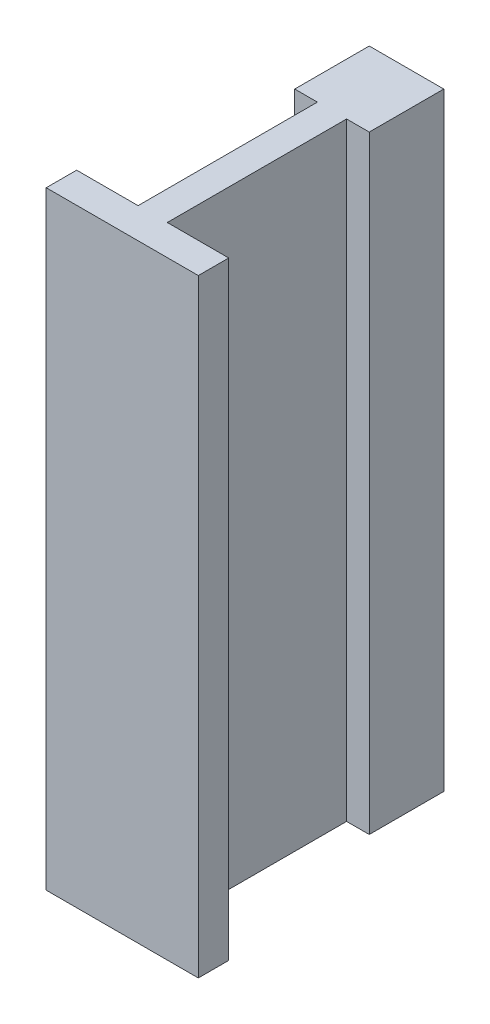
ISO-10303-21;
HEADER;
FILE_DESCRIPTION(('STEP AP214'),'2;1');
FILE_NAME('part.step','',(''),(''),'','','');
FILE_SCHEMA(('AUTOMOTIVE_DESIGN { 1 0 10303 214 1 1 1 1 }'));
ENDSEC;
DATA;
#1=APPLICATION_CONTEXT('core data for automotive mechanical design processes');
#2=APPLICATION_PROTOCOL_DEFINITION('international standard','automotive_design',2000,#1);
#3=PRODUCT_CONTEXT('',#1,'mechanical');
#4=PRODUCT('Part','Part','',(#3));
#5=PRODUCT_RELATED_PRODUCT_CATEGORY('part','',(#4));
#6=PRODUCT_DEFINITION_FORMATION('','',#4);
#7=PRODUCT_DEFINITION_CONTEXT('part definition',#1,'design');
#8=PRODUCT_DEFINITION('design','',#6,#7);
#9=PRODUCT_DEFINITION_SHAPE('','',#8);
#10=(LENGTH_UNIT() NAMED_UNIT(*) SI_UNIT(.MILLI.,.METRE.));
#11=(NAMED_UNIT(*) PLANE_ANGLE_UNIT() SI_UNIT($,.RADIAN.));
#12=(NAMED_UNIT(*) SI_UNIT($,.STERADIAN.) SOLID_ANGLE_UNIT());
#13=UNCERTAINTY_MEASURE_WITH_UNIT(LENGTH_MEASURE(1.E-05),#10,'distance_accuracy_value','');
#14=(GEOMETRIC_REPRESENTATION_CONTEXT(3) GLOBAL_UNCERTAINTY_ASSIGNED_CONTEXT((#13)) GLOBAL_UNIT_ASSIGNED_CONTEXT((#10,
#11,#12)) REPRESENTATION_CONTEXT('',''));
#15=CARTESIAN_POINT('',(0.,0.,0.));
#16=DIRECTION('',(0.,0.,1.));
#17=DIRECTION('',(1.,0.,0.));
#18=AXIS2_PLACEMENT_3D('',#15,#16,#17);
#19=CARTESIAN_POINT('',(0.750909090909092,40.,1.55909090909091));
#20=DIRECTION('',(-1.,0.,0.));
#21=DIRECTION('',(0.,0.,1.));
#22=AXIS2_PLACEMENT_3D('',#19,#20,#21);
#23=PLANE('',#22);
#24=DIRECTION('',(0.,0.,-1.));
#25=VECTOR('',#24,1.);
#26=CARTESIAN_POINT('',(0.750909090909092,40.,1.55909090909091));
#27=LINE('',#26,#25);
#28=CARTESIAN_POINT('',(0.750909090909093,40.,13.3490909090909));
#29=VERTEX_POINT('',#28);
#30=CARTESIAN_POINT('',(0.750909090909092,40.,1.55909090909091));
#31=VERTEX_POINT('',#30);
#32=EDGE_CURVE('E90',#29,#31,#27,.T.);
#33=ORIENTED_EDGE('',*,*,#32,.F.);
#34=DIRECTION('',(0.,-1.,0.));
#35=VECTOR('',#34,1.);
#36=CARTESIAN_POINT('',(0.750909090909093,40.,13.3490909090909));
#37=LINE('',#36,#35);
#38=CARTESIAN_POINT('',(0.750909090909092,0.,13.3490909090909));
#39=VERTEX_POINT('',#38);
#40=EDGE_CURVE('E233',#29,#39,#37,.T.);
#41=ORIENTED_EDGE('',*,*,#40,.T.);
#42=DIRECTION('',(0.,0.,-1.));
#43=VECTOR('',#42,1.);
#44=CARTESIAN_POINT('',(0.750909090909092,0.,1.55909090909091));
#45=LINE('',#44,#43);
#46=CARTESIAN_POINT('',(0.750909090909092,0.,1.55909090909091));
#47=VERTEX_POINT('',#46);
#48=EDGE_CURVE('E130',#39,#47,#45,.T.);
#49=ORIENTED_EDGE('',*,*,#48,.T.);
#50=DIRECTION('',(0.,-1.,0.));
#51=VECTOR('',#50,1.);
#52=CARTESIAN_POINT('',(0.750909090909092,40.,1.55909090909091));
#53=LINE('',#52,#51);
#54=EDGE_CURVE('E11',#31,#47,#53,.T.);
#55=ORIENTED_EDGE('',*,*,#54,.F.);
#56=EDGE_LOOP('',(#33,#41,#49,#55));
#57=FACE_BOUND('',#56,.T.);
#58=ADVANCED_FACE('F35',(#57),#23,.F.);
#59=CARTESIAN_POINT('',(2.24090909090909,40.,1.55909090909091));
#60=DIRECTION('',(0.,0.,-1.));
#61=DIRECTION('',(-1.,0.,0.));
#62=AXIS2_PLACEMENT_3D('',#59,#60,#61);
#63=PLANE('',#62);
#64=DIRECTION('',(1.,0.,0.));
#65=VECTOR('',#64,1.);
#66=CARTESIAN_POINT('',(2.24090909090909,0.,1.55909090909091));
#67=LINE('',#66,#65);
#68=CARTESIAN_POINT('',(2.24090909090909,0.,1.55909090909091));
#69=VERTEX_POINT('',#68);
#70=EDGE_CURVE('E132',#47,#69,#67,.T.);
#71=ORIENTED_EDGE('',*,*,#70,.T.);
#72=DIRECTION('',(0.,-1.,0.));
#73=VECTOR('',#72,1.);
#74=CARTESIAN_POINT('',(2.24090909090909,40.,1.55909090909091));
#75=LINE('',#74,#73);
#76=CARTESIAN_POINT('',(2.24090909090909,40.,1.55909090909091));
#77=VERTEX_POINT('',#76);
#78=EDGE_CURVE('E42',#77,#69,#75,.T.);
#79=ORIENTED_EDGE('',*,*,#78,.F.);
#80=DIRECTION('',(1.,0.,0.));
#81=VECTOR('',#80,1.);
#82=CARTESIAN_POINT('',(2.24090909090909,40.,1.55909090909091));
#83=LINE('',#82,#81);
#84=EDGE_CURVE('E239',#31,#77,#83,.T.);
#85=ORIENTED_EDGE('',*,*,#84,.F.);
#86=ORIENTED_EDGE('',*,*,#54,.T.);
#87=EDGE_LOOP('',(#71,#79,#85,#86));
#88=FACE_BOUND('',#87,.T.);
#89=ADVANCED_FACE('F240',(#88),#63,.F.);
#90=CARTESIAN_POINT('',(2.24090909090909,40.,-3.34090909090909));
#91=DIRECTION('',(-1.,0.,0.));
#92=DIRECTION('',(0.,0.,1.));
#93=AXIS2_PLACEMENT_3D('',#90,#91,#92);
#94=PLANE('',#93);
#95=DIRECTION('',(0.,0.,-1.));
#96=VECTOR('',#95,1.);
#97=CARTESIAN_POINT('',(2.24090909090909,0.,-3.34090909090909));
#98=LINE('',#97,#96);
#99=CARTESIAN_POINT('',(2.24090909090909,0.,-3.34090909090909));
#100=VERTEX_POINT('',#99);
#101=EDGE_CURVE('E135',#69,#100,#98,.T.);
#102=ORIENTED_EDGE('',*,*,#101,.T.);
#103=DIRECTION('',(0.,-1.,0.));
#104=VECTOR('',#103,1.);
#105=CARTESIAN_POINT('',(2.24090909090909,40.,-3.34090909090909));
#106=LINE('',#105,#104);
#107=CARTESIAN_POINT('',(2.24090909090909,40.,-3.34090909090909));
#108=VERTEX_POINT('',#107);
#109=EDGE_CURVE('E119',#108,#100,#106,.T.);
#110=ORIENTED_EDGE('',*,*,#109,.F.);
#111=DIRECTION('',(0.,0.,-1.));
#112=VECTOR('',#111,1.);
#113=CARTESIAN_POINT('',(2.24090909090909,40.,-3.34090909090909));
#114=LINE('',#113,#112);
#115=EDGE_CURVE('E107',#77,#108,#114,.T.);
#116=ORIENTED_EDGE('',*,*,#115,.F.);
#117=ORIENTED_EDGE('',*,*,#78,.T.);
#118=EDGE_LOOP('',(#102,#110,#116,#117));
#119=FACE_BOUND('',#118,.T.);
#120=ADVANCED_FACE('F150',(#119),#94,.F.);
#121=CARTESIAN_POINT('',(-2.65909090909091,40.,-3.34090909090909));
#122=DIRECTION('',(0.,0.,1.));
#123=DIRECTION('',(1.,0.,0.));
#124=AXIS2_PLACEMENT_3D('',#121,#122,#123);
#125=PLANE('',#124);
#126=DIRECTION('',(-1.,0.,0.));
#127=VECTOR('',#126,1.);
#128=CARTESIAN_POINT('',(-2.65909090909091,0.,-3.34090909090909));
#129=LINE('',#128,#127);
#130=CARTESIAN_POINT('',(-2.65909090909091,0.,-3.34090909090909));
#131=VERTEX_POINT('',#130);
#132=EDGE_CURVE('E116',#100,#131,#129,.T.);
#133=ORIENTED_EDGE('',*,*,#132,.T.);
#134=DIRECTION('',(0.,-1.,0.));
#135=VECTOR('',#134,1.);
#136=CARTESIAN_POINT('',(-2.65909090909091,40.,-3.34090909090909));
#137=LINE('',#136,#135);
#138=CARTESIAN_POINT('',(-2.65909090909091,40.,-3.34090909090909));
#139=VERTEX_POINT('',#138);
#140=EDGE_CURVE('E113',#139,#131,#137,.T.);
#141=ORIENTED_EDGE('',*,*,#140,.F.);
#142=DIRECTION('',(-1.,0.,0.));
#143=VECTOR('',#142,1.);
#144=CARTESIAN_POINT('',(-2.65909090909091,40.,-3.34090909090909));
#145=LINE('',#144,#143);
#146=EDGE_CURVE('E100',#108,#139,#145,.T.);
#147=ORIENTED_EDGE('',*,*,#146,.F.);
#148=ORIENTED_EDGE('',*,*,#109,.T.);
#149=EDGE_LOOP('',(#133,#141,#147,#148));
#150=FACE_BOUND('',#149,.T.);
#151=ADVANCED_FACE('F114',(#150),#125,.F.);
#152=CARTESIAN_POINT('',(-2.65909090909091,40.,1.55909090909091));
#153=DIRECTION('',(1.,0.,0.));
#154=DIRECTION('',(0.,0.,-1.));
#155=AXIS2_PLACEMENT_3D('',#152,#153,#154);
#156=PLANE('',#155);
#157=DIRECTION('',(0.,0.,1.));
#158=VECTOR('',#157,1.);
#159=CARTESIAN_POINT('',(-2.65909090909091,0.,1.55909090909091));
#160=LINE('',#159,#158);
#161=CARTESIAN_POINT('',(-2.65909090909091,0.,1.55909090909091));
#162=VERTEX_POINT('',#161);
#163=EDGE_CURVE('E138',#131,#162,#160,.T.);
#164=ORIENTED_EDGE('',*,*,#163,.T.);
#165=DIRECTION('',(0.,-1.,0.));
#166=VECTOR('',#165,1.);
#167=CARTESIAN_POINT('',(-2.65909090909091,40.,1.55909090909091));
#168=LINE('',#167,#166);
#169=CARTESIAN_POINT('',(-2.65909090909091,40.,1.55909090909091));
#170=VERTEX_POINT('',#169);
#171=EDGE_CURVE('E120',#170,#162,#168,.T.);
#172=ORIENTED_EDGE('',*,*,#171,.F.);
#173=DIRECTION('',(0.,0.,1.));
#174=VECTOR('',#173,1.);
#175=CARTESIAN_POINT('',(-2.65909090909091,40.,1.55909090909091));
#176=LINE('',#175,#174);
#177=EDGE_CURVE('E104',#139,#170,#176,.T.);
#178=ORIENTED_EDGE('',*,*,#177,.F.);
#179=ORIENTED_EDGE('',*,*,#140,.T.);
#180=EDGE_LOOP('',(#164,#172,#178,#179));
#181=FACE_BOUND('',#180,.T.);
#182=ADVANCED_FACE('F122',(#181),#156,.F.);
#183=CARTESIAN_POINT('',(-1.16909090909091,40.,1.55909090909091));
#184=DIRECTION('',(0.,0.,-1.));
#185=DIRECTION('',(-1.,0.,0.));
#186=AXIS2_PLACEMENT_3D('',#183,#184,#185);
#187=PLANE('',#186);
#188=DIRECTION('',(1.,0.,0.));
#189=VECTOR('',#188,1.);
#190=CARTESIAN_POINT('',(-1.16909090909091,0.,1.55909090909091));
#191=LINE('',#190,#189);
#192=CARTESIAN_POINT('',(-1.16909090909091,0.,1.55909090909091));
#193=VERTEX_POINT('',#192);
#194=EDGE_CURVE('E84',#162,#193,#191,.T.);
#195=ORIENTED_EDGE('',*,*,#194,.T.);
#196=DIRECTION('',(0.,-1.,0.));
#197=VECTOR('',#196,1.);
#198=CARTESIAN_POINT('',(-1.16909090909091,40.,1.55909090909091));
#199=LINE('',#198,#197);
#200=CARTESIAN_POINT('',(-1.16909090909091,40.,1.55909090909091));
#201=VERTEX_POINT('',#200);
#202=EDGE_CURVE('E129',#201,#193,#199,.T.);
#203=ORIENTED_EDGE('',*,*,#202,.F.);
#204=DIRECTION('',(1.,0.,0.));
#205=VECTOR('',#204,1.);
#206=CARTESIAN_POINT('',(-1.16909090909091,40.,1.55909090909091));
#207=LINE('',#206,#205);
#208=EDGE_CURVE('E57',#170,#201,#207,.T.);
#209=ORIENTED_EDGE('',*,*,#208,.F.);
#210=ORIENTED_EDGE('',*,*,#171,.T.);
#211=EDGE_LOOP('',(#195,#203,#209,#210));
#212=FACE_BOUND('',#211,.T.);
#213=ADVANCED_FACE('F158',(#212),#187,.F.);
#214=CARTESIAN_POINT('',(-1.16909090909091,40.,3.01363636363636));
#215=DIRECTION('',(1.,0.,0.));
#216=DIRECTION('',(0.,0.,-1.));
#217=AXIS2_PLACEMENT_3D('',#214,#215,#216);
#218=PLANE('',#217);
#219=DIRECTION('',(0.,0.,1.));
#220=VECTOR('',#219,1.);
#221=CARTESIAN_POINT('',(-1.16909090909091,0.,3.01363636363636));
#222=LINE('',#221,#220);
#223=CARTESIAN_POINT('',(-1.16909090909091,0.,13.3490909090909));
#224=VERTEX_POINT('',#223);
#225=EDGE_CURVE('E141',#193,#224,#222,.T.);
#226=ORIENTED_EDGE('',*,*,#225,.T.);
#227=DIRECTION('',(0.,1.,0.));
#228=VECTOR('',#227,1.);
#229=CARTESIAN_POINT('',(-1.16909090909091,40.,13.3490909090909));
#230=LINE('',#229,#228);
#231=CARTESIAN_POINT('',(-1.16909090909091,40.,13.3490909090909));
#232=VERTEX_POINT('',#231);
#233=EDGE_CURVE('E165',#224,#232,#230,.T.);
#234=ORIENTED_EDGE('',*,*,#233,.T.);
#235=DIRECTION('',(0.,0.,1.));
#236=VECTOR('',#235,1.);
#237=CARTESIAN_POINT('',(-1.16909090909091,40.,3.01363636363636));
#238=LINE('',#237,#236);
#239=EDGE_CURVE('E124',#201,#232,#238,.T.);
#240=ORIENTED_EDGE('',*,*,#239,.F.);
#241=ORIENTED_EDGE('',*,*,#202,.T.);
#242=EDGE_LOOP('',(#226,#234,#240,#241));
#243=FACE_BOUND('',#242,.T.);
#244=ADVANCED_FACE('F162',(#243),#218,.F.);
#245=CARTESIAN_POINT('',(0.,40.,0.));
#246=DIRECTION('',(0.,-1.,0.));
#247=DIRECTION('',(0.,0.,-1.));
#248=AXIS2_PLACEMENT_3D('',#245,#246,#247);
#249=PLANE('',#248);
#250=ORIENTED_EDGE('',*,*,#239,.T.);
#251=DIRECTION('',(-1.,0.,0.));
#252=VECTOR('',#251,1.);
#253=CARTESIAN_POINT('',(-5.20909090909091,40.,13.3490909090909));
#254=LINE('',#253,#252);
#255=CARTESIAN_POINT('',(-5.20909090909091,40.,13.3490909090909));
#256=VERTEX_POINT('',#255);
#257=EDGE_CURVE('E170',#232,#256,#254,.T.);
#258=ORIENTED_EDGE('',*,*,#257,.T.);
#259=DIRECTION('',(0.,0.,1.));
#260=VECTOR('',#259,1.);
#261=CARTESIAN_POINT('',(-5.20909090909091,40.,13.3490909090909));
#262=LINE('',#261,#260);
#263=CARTESIAN_POINT('',(-5.20909090909091,40.,15.3490909090909));
#264=VERTEX_POINT('',#263);
#265=EDGE_CURVE('E218',#256,#264,#262,.T.);
#266=ORIENTED_EDGE('',*,*,#265,.T.);
#267=DIRECTION('',(-1.,0.,0.));
#268=VECTOR('',#267,1.);
#269=CARTESIAN_POINT('',(-1.16909090909091,40.,15.3490909090909));
#270=LINE('',#269,#268);
#271=CARTESIAN_POINT('',(4.79090909090909,40.,15.3490909090909));
#272=VERTEX_POINT('',#271);
#273=EDGE_CURVE('E133',#272,#264,#270,.T.);
#274=ORIENTED_EDGE('',*,*,#273,.F.);
#275=DIRECTION('',(0.,0.,-1.));
#276=VECTOR('',#275,1.);
#277=CARTESIAN_POINT('',(4.79090909090909,40.,13.3490909090909));
#278=LINE('',#277,#276);
#279=CARTESIAN_POINT('',(4.79090909090909,40.,13.3490909090909));
#280=VERTEX_POINT('',#279);
#281=EDGE_CURVE('E224',#272,#280,#278,.T.);
#282=ORIENTED_EDGE('',*,*,#281,.T.);
#283=EDGE_CURVE('E49',#280,#29,#254,.T.);
#284=ORIENTED_EDGE('',*,*,#283,.T.);
#285=ORIENTED_EDGE('',*,*,#32,.T.);
#286=ORIENTED_EDGE('',*,*,#84,.T.);
#287=ORIENTED_EDGE('',*,*,#115,.T.);
#288=ORIENTED_EDGE('',*,*,#146,.T.);
#289=ORIENTED_EDGE('',*,*,#177,.T.);
#290=ORIENTED_EDGE('',*,*,#208,.T.);
#291=EDGE_LOOP('',(#250,#258,#266,#274,#282,#284,#285,#286,#287,#288,#289,#290));
#292=FACE_BOUND('',#291,.T.);
#293=ADVANCED_FACE('F102',(#292),#249,.F.);
#294=CARTESIAN_POINT('',(0.,0.,0.));
#295=DIRECTION('',(0.,-1.,0.));
#296=DIRECTION('',(0.,0.,-1.));
#297=AXIS2_PLACEMENT_3D('',#294,#295,#296);
#298=PLANE('',#297);
#299=ORIENTED_EDGE('',*,*,#48,.F.);
#300=DIRECTION('',(-1.,0.,0.));
#301=VECTOR('',#300,1.);
#302=CARTESIAN_POINT('',(-5.20909090909091,0.,13.3490909090909));
#303=LINE('',#302,#301);
#304=CARTESIAN_POINT('',(4.79090909090909,0.,13.3490909090909));
#305=VERTEX_POINT('',#304);
#306=EDGE_CURVE('E202',#305,#39,#303,.T.);
#307=ORIENTED_EDGE('',*,*,#306,.F.);
#308=DIRECTION('',(0.,0.,-1.));
#309=VECTOR('',#308,1.);
#310=CARTESIAN_POINT('',(4.79090909090909,0.,13.3490909090909));
#311=LINE('',#310,#309);
#312=CARTESIAN_POINT('',(4.79090909090909,0.,15.3490909090909));
#313=VERTEX_POINT('',#312);
#314=EDGE_CURVE('E211',#313,#305,#311,.T.);
#315=ORIENTED_EDGE('',*,*,#314,.F.);
#316=DIRECTION('',(1.,0.,0.));
#317=VECTOR('',#316,1.);
#318=CARTESIAN_POINT('',(-1.16909090909091,0.,15.3490909090909));
#319=LINE('',#318,#317);
#320=CARTESIAN_POINT('',(-5.20909090909091,0.,15.3490909090909));
#321=VERTEX_POINT('',#320);
#322=EDGE_CURVE('E235',#321,#313,#319,.T.);
#323=ORIENTED_EDGE('',*,*,#322,.F.);
#324=DIRECTION('',(0.,0.,1.));
#325=VECTOR('',#324,1.);
#326=CARTESIAN_POINT('',(-5.20909090909091,0.,13.3490909090909));
#327=LINE('',#326,#325);
#328=CARTESIAN_POINT('',(-5.20909090909091,0.,13.3490909090909));
#329=VERTEX_POINT('',#328);
#330=EDGE_CURVE('E208',#329,#321,#327,.T.);
#331=ORIENTED_EDGE('',*,*,#330,.F.);
#332=EDGE_CURVE('E212',#224,#329,#303,.T.);
#333=ORIENTED_EDGE('',*,*,#332,.F.);
#334=ORIENTED_EDGE('',*,*,#225,.F.);
#335=ORIENTED_EDGE('',*,*,#194,.F.);
#336=ORIENTED_EDGE('',*,*,#163,.F.);
#337=ORIENTED_EDGE('',*,*,#132,.F.);
#338=ORIENTED_EDGE('',*,*,#101,.F.);
#339=ORIENTED_EDGE('',*,*,#70,.F.);
#340=EDGE_LOOP('',(#299,#307,#315,#323,#331,#333,#334,#335,#336,#337,#338,#339));
#341=FACE_BOUND('',#340,.T.);
#342=ADVANCED_FACE('F156',(#341),#298,.T.);
#343=CARTESIAN_POINT('',(0.,0.,15.3490909090909));
#344=DIRECTION('',(0.,0.,1.));
#345=DIRECTION('',(1.,0.,0.));
#346=AXIS2_PLACEMENT_3D('',#343,#344,#345);
#347=PLANE('',#346);
#348=ORIENTED_EDGE('',*,*,#273,.T.);
#349=DIRECTION('',(0.,1.,0.));
#350=VECTOR('',#349,1.);
#351=CARTESIAN_POINT('',(-5.20909090909091,0.,15.3490909090909));
#352=LINE('',#351,#350);
#353=EDGE_CURVE('E228',#321,#264,#352,.T.);
#354=ORIENTED_EDGE('',*,*,#353,.F.);
#355=ORIENTED_EDGE('',*,*,#322,.T.);
#356=DIRECTION('',(0.,1.,0.));
#357=VECTOR('',#356,1.);
#358=CARTESIAN_POINT('',(4.79090909090909,0.,15.3490909090909));
#359=LINE('',#358,#357);
#360=EDGE_CURVE('E217',#313,#272,#359,.T.);
#361=ORIENTED_EDGE('',*,*,#360,.T.);
#362=EDGE_LOOP('',(#348,#354,#355,#361));
#363=FACE_BOUND('',#362,.T.);
#364=ADVANCED_FACE('F261',(#363),#347,.T.);
#365=CARTESIAN_POINT('',(-5.20909090909091,0.,13.3490909090909));
#366=DIRECTION('',(-1.,0.,0.));
#367=DIRECTION('',(0.,0.,1.));
#368=AXIS2_PLACEMENT_3D('',#365,#366,#367);
#369=PLANE('',#368);
#370=ORIENTED_EDGE('',*,*,#265,.F.);
#371=DIRECTION('',(0.,1.,0.));
#372=VECTOR('',#371,1.);
#373=CARTESIAN_POINT('',(-5.20909090909091,0.,13.3490909090909));
#374=LINE('',#373,#372);
#375=EDGE_CURVE('E207',#329,#256,#374,.T.);
#376=ORIENTED_EDGE('',*,*,#375,.F.);
#377=ORIENTED_EDGE('',*,*,#330,.T.);
#378=ORIENTED_EDGE('',*,*,#353,.T.);
#379=EDGE_LOOP('',(#370,#376,#377,#378));
#380=FACE_BOUND('',#379,.T.);
#381=ADVANCED_FACE('F266',(#380),#369,.T.);
#382=CARTESIAN_POINT('',(-5.20909090909091,0.,13.3490909090909));
#383=DIRECTION('',(0.,0.,-1.));
#384=DIRECTION('',(-1.,0.,0.));
#385=AXIS2_PLACEMENT_3D('',#382,#383,#384);
#386=PLANE('',#385);
#387=ORIENTED_EDGE('',*,*,#233,.F.);
#388=ORIENTED_EDGE('',*,*,#332,.T.);
#389=ORIENTED_EDGE('',*,*,#375,.T.);
#390=ORIENTED_EDGE('',*,*,#257,.F.);
#391=EDGE_LOOP('',(#387,#388,#389,#390));
#392=FACE_BOUND('',#391,.T.);
#393=ADVANCED_FACE('F272',(#392),#386,.T.);
#394=ORIENTED_EDGE('',*,*,#40,.F.);
#395=ORIENTED_EDGE('',*,*,#283,.F.);
#396=DIRECTION('',(0.,1.,0.));
#397=VECTOR('',#396,1.);
#398=CARTESIAN_POINT('',(4.79090909090909,0.,13.3490909090909));
#399=LINE('',#398,#397);
#400=EDGE_CURVE('E199',#305,#280,#399,.T.);
#401=ORIENTED_EDGE('',*,*,#400,.F.);
#402=ORIENTED_EDGE('',*,*,#306,.T.);
#403=EDGE_LOOP('',(#394,#395,#401,#402));
#404=FACE_BOUND('',#403,.T.);
#405=ADVANCED_FACE('F201',(#404),#386,.T.);
#406=CARTESIAN_POINT('',(4.79090909090909,0.,13.3490909090909));
#407=DIRECTION('',(1.,0.,0.));
#408=DIRECTION('',(0.,0.,-1.));
#409=AXIS2_PLACEMENT_3D('',#406,#407,#408);
#410=PLANE('',#409);
#411=ORIENTED_EDGE('',*,*,#281,.F.);
#412=ORIENTED_EDGE('',*,*,#360,.F.);
#413=ORIENTED_EDGE('',*,*,#314,.T.);
#414=ORIENTED_EDGE('',*,*,#400,.T.);
#415=EDGE_LOOP('',(#411,#412,#413,#414));
#416=FACE_BOUND('',#415,.T.);
#417=ADVANCED_FACE('F215',(#416),#410,.T.);
#418=CLOSED_SHELL('',(#58,#89,#120,#151,#182,#213,#244,#293,#342,#364,#381,#393,#405,#417));
#419=MANIFOLD_SOLID_BREP('B2',#418);
#420=ADVANCED_BREP_SHAPE_REPRESENTATION('',(#18,#419),#14);
#421=SHAPE_DEFINITION_REPRESENTATION(#9,#420);
ENDSEC;
END-ISO-10303-21;
